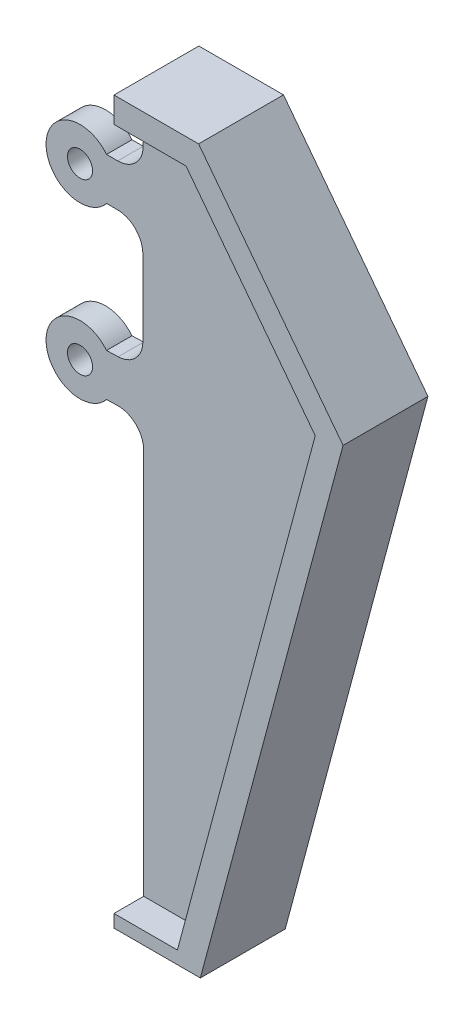
ISO-10303-21;
HEADER;
FILE_DESCRIPTION(('STEP AP214'),'2;1');
FILE_NAME('part.step','',(''),(''),'','','');
FILE_SCHEMA(('AUTOMOTIVE_DESIGN { 1 0 10303 214 1 1 1 1 }'));
ENDSEC;
DATA;
#1=APPLICATION_CONTEXT('core data for automotive mechanical design processes');
#2=APPLICATION_PROTOCOL_DEFINITION('international standard','automotive_design',2000,#1);
#3=PRODUCT_CONTEXT('',#1,'mechanical');
#4=PRODUCT('Part','Part','',(#3));
#5=PRODUCT_RELATED_PRODUCT_CATEGORY('part','',(#4));
#6=PRODUCT_DEFINITION_FORMATION('','',#4);
#7=PRODUCT_DEFINITION_CONTEXT('part definition',#1,'design');
#8=PRODUCT_DEFINITION('design','',#6,#7);
#9=PRODUCT_DEFINITION_SHAPE('','',#8);
#10=(LENGTH_UNIT() NAMED_UNIT(*) SI_UNIT(.MILLI.,.METRE.));
#11=(NAMED_UNIT(*) PLANE_ANGLE_UNIT() SI_UNIT($,.RADIAN.));
#12=(NAMED_UNIT(*) SI_UNIT($,.STERADIAN.) SOLID_ANGLE_UNIT());
#13=UNCERTAINTY_MEASURE_WITH_UNIT(LENGTH_MEASURE(1.E-05),#10,'distance_accuracy_value','');
#14=(GEOMETRIC_REPRESENTATION_CONTEXT(3) GLOBAL_UNCERTAINTY_ASSIGNED_CONTEXT((#13)) GLOBAL_UNIT_ASSIGNED_CONTEXT((#10,
#11,#12)) REPRESENTATION_CONTEXT('',''));
#15=CARTESIAN_POINT('',(0.,0.,0.));
#16=DIRECTION('',(0.,0.,1.));
#17=DIRECTION('',(1.,0.,0.));
#18=AXIS2_PLACEMENT_3D('',#15,#16,#17);
#19=CARTESIAN_POINT('',(81.5633631748623,1.61587612148802,-5.));
#20=DIRECTION('',(-0.965925822985211,0.258819057432683,0.));
#21=DIRECTION('',(-0.258819057432683,-0.965925822985211,0.));
#22=AXIS2_PLACEMENT_3D('',#19,#20,#21);
#23=PLANE('',#22);
#24=DIRECTION('',(0.,0.,1.));
#25=VECTOR('',#24,1.);
#26=CARTESIAN_POINT('',(65.326310514337,-58.9816262786255,-5.));
#27=LINE('',#26,#25);
#28=CARTESIAN_POINT('',(65.326310514337,-58.9816262786255,-5.));
#29=VERTEX_POINT('',#28);
#30=CARTESIAN_POINT('',(65.326310514337,-58.9816262786255,-1.5));
#31=VERTEX_POINT('',#30);
#32=EDGE_CURVE('E429',#29,#31,#27,.T.);
#33=ORIENTED_EDGE('',*,*,#32,.T.);
#34=DIRECTION('',(0.258819057432683,0.965925822985211,0.));
#35=VECTOR('',#34,1.);
#36=CARTESIAN_POINT('',(81.5633631748623,1.61587612148802,-1.5));
#37=LINE('',#36,#35);
#38=CARTESIAN_POINT('',(81.562929535086,1.6142577558935,-1.5));
#39=VERTEX_POINT('',#38);
#40=EDGE_CURVE('E396',#31,#39,#37,.T.);
#41=ORIENTED_EDGE('',*,*,#40,.T.);
#42=DIRECTION('',(0.,0.,-1.));
#43=VECTOR('',#42,1.);
#44=CARTESIAN_POINT('',(81.562929535086,1.61425775589349,-5.));
#45=LINE('',#44,#43);
#46=CARTESIAN_POINT('',(81.562929535086,1.6142577558935,1.5));
#47=VERTEX_POINT('',#46);
#48=EDGE_CURVE('E11',#47,#39,#45,.T.);
#49=ORIENTED_EDGE('',*,*,#48,.F.);
#50=DIRECTION('',(0.258819057432683,0.965925822985211,0.));
#51=VECTOR('',#50,1.);
#52=CARTESIAN_POINT('',(81.5633631748623,1.61587612148802,1.5));
#53=LINE('',#52,#51);
#54=CARTESIAN_POINT('',(65.326310514337,-58.9816262786255,1.5));
#55=VERTEX_POINT('',#54);
#56=EDGE_CURVE('E389',#55,#47,#53,.T.);
#57=ORIENTED_EDGE('',*,*,#56,.F.);
#58=CARTESIAN_POINT('',(65.326310514337,-58.9816262786255,5.));
#59=VERTEX_POINT('',#58);
#60=EDGE_CURVE('E428',#55,#59,#27,.T.);
#61=ORIENTED_EDGE('',*,*,#60,.T.);
#62=DIRECTION('',(-0.258819057432683,-0.965925822985211,0.));
#63=VECTOR('',#62,1.);
#64=CARTESIAN_POINT('',(81.5633631748623,1.61587612148802,5.));
#65=LINE('',#64,#63);
#66=CARTESIAN_POINT('',(81.5633631748623,1.61587612148802,5.));
#67=VERTEX_POINT('',#66);
#68=EDGE_CURVE('E441',#67,#59,#65,.T.);
#69=ORIENTED_EDGE('',*,*,#68,.F.);
#70=DIRECTION('',(0.,0.,1.));
#71=VECTOR('',#70,1.);
#72=CARTESIAN_POINT('',(81.5633631748623,1.61587612148802,-5.));
#73=LINE('',#72,#71);
#74=CARTESIAN_POINT('',(81.5633631748623,1.61587612148802,-5.));
#75=VERTEX_POINT('',#74);
#76=EDGE_CURVE('E492',#75,#67,#73,.T.);
#77=ORIENTED_EDGE('',*,*,#76,.F.);
#78=DIRECTION('',(-0.258819057432683,-0.965925822985211,0.));
#79=VECTOR('',#78,1.);
#80=CARTESIAN_POINT('',(81.5633631748623,1.61587612148802,-5.));
#81=LINE('',#80,#79);
#82=EDGE_CURVE('E465',#75,#29,#81,.T.);
#83=ORIENTED_EDGE('',*,*,#82,.T.);
#84=EDGE_LOOP('',(#33,#41,#49,#57,#61,#69,#77,#83));
#85=FACE_BOUND('',#84,.T.);
#86=ADVANCED_FACE('F33',(#85),#23,.T.);
#87=CARTESIAN_POINT('',(64.9249193695849,-60.4796383480592,-5.));
#88=DIRECTION('',(0.,-1.,0.));
#89=DIRECTION('',(1.,0.,0.));
#90=AXIS2_PLACEMENT_3D('',#87,#88,#89);
#91=PLANE('',#90);
#92=DIRECTION('',(0.,0.,1.));
#93=VECTOR('',#92,1.);
#94=CARTESIAN_POINT('',(64.9253009944768,-60.4796383480592,-5.));
#95=LINE('',#94,#93);
#96=CARTESIAN_POINT('',(64.9253009944768,-60.4796383480592,-1.5));
#97=VERTEX_POINT('',#96);
#98=CARTESIAN_POINT('',(64.9253009944768,-60.4796383480592,1.5));
#99=VERTEX_POINT('',#98);
#100=EDGE_CURVE('E41',#97,#99,#95,.T.);
#101=ORIENTED_EDGE('',*,*,#100,.F.);
#102=DIRECTION('',(-1.,0.,0.));
#103=VECTOR('',#102,1.);
#104=CARTESIAN_POINT('',(64.9249193695849,-60.4796383480592,-1.5));
#105=LINE('',#104,#103);
#106=CARTESIAN_POINT('',(64.9249193695849,-60.4796383480592,-1.5));
#107=VERTEX_POINT('',#106);
#108=EDGE_CURVE('E402',#97,#107,#105,.T.);
#109=ORIENTED_EDGE('',*,*,#108,.T.);
#110=DIRECTION('',(0.,0.,1.));
#111=VECTOR('',#110,1.);
#112=CARTESIAN_POINT('',(64.9249193695849,-60.4796383480592,-5.));
#113=LINE('',#112,#111);
#114=CARTESIAN_POINT('',(64.9249193695849,-60.4796383480592,-5.));
#115=VERTEX_POINT('',#114);
#116=EDGE_CURVE('E488',#115,#107,#113,.T.);
#117=ORIENTED_EDGE('',*,*,#116,.F.);
#118=DIRECTION('',(1.,0.,0.));
#119=VECTOR('',#118,1.);
#120=CARTESIAN_POINT('',(64.9249193695849,-60.4796383480592,-5.));
#121=LINE('',#120,#119);
#122=CARTESIAN_POINT('',(68.0307479214384,-60.4796383480592,-5.));
#123=VERTEX_POINT('',#122);
#124=EDGE_CURVE('E467',#115,#123,#121,.T.);
#125=ORIENTED_EDGE('',*,*,#124,.T.);
#126=DIRECTION('',(0.,0.,1.));
#127=VECTOR('',#126,1.);
#128=CARTESIAN_POINT('',(68.0307479214384,-60.4796383480592,-5.));
#129=LINE('',#128,#127);
#130=CARTESIAN_POINT('',(68.0307479214384,-60.4796383480592,5.));
#131=VERTEX_POINT('',#130);
#132=EDGE_CURVE('E486',#123,#131,#129,.T.);
#133=ORIENTED_EDGE('',*,*,#132,.T.);
#134=DIRECTION('',(1.,0.,0.));
#135=VECTOR('',#134,1.);
#136=CARTESIAN_POINT('',(64.9249193695849,-60.4796383480592,5.));
#137=LINE('',#136,#135);
#138=CARTESIAN_POINT('',(64.9249193695849,-60.4796383480592,5.));
#139=VERTEX_POINT('',#138);
#140=EDGE_CURVE('E444',#139,#131,#137,.T.);
#141=ORIENTED_EDGE('',*,*,#140,.F.);
#142=CARTESIAN_POINT('',(64.9249193695849,-60.4796383480592,1.5));
#143=VERTEX_POINT('',#142);
#144=EDGE_CURVE('E491',#143,#139,#113,.T.);
#145=ORIENTED_EDGE('',*,*,#144,.F.);
#146=DIRECTION('',(-1.,0.,0.));
#147=VECTOR('',#146,1.);
#148=CARTESIAN_POINT('',(64.9249193695849,-60.4796383480592,1.5));
#149=LINE('',#148,#147);
#150=EDGE_CURVE('E52',#99,#143,#149,.T.);
#151=ORIENTED_EDGE('',*,*,#150,.F.);
#152=EDGE_LOOP('',(#101,#109,#117,#125,#133,#141,#145,#151));
#153=FACE_BOUND('',#152,.T.);
#154=ADVANCED_FACE('F512',(#153),#91,.T.);
#155=CARTESIAN_POINT('',(64.9249193695849,-60.4796383480592,5.));
#156=DIRECTION('',(-0.000281150325614666,0.999999960477246,0.));
#157=DIRECTION('',(-0.999999960477247,-0.000281150325614666,0.));
#158=AXIS2_PLACEMENT_3D('',#155,#156,#157);
#159=PLANE('',#158);
#160=DIRECTION('',(0.999999960477247,0.000281150325614666,0.));
#161=VECTOR('',#160,1.);
#162=CARTESIAN_POINT('',(64.9249193695849,-60.4796383480592,-1.5));
#163=LINE('',#162,#161);
#164=CARTESIAN_POINT('',(57.8542162380142,-60.4816262786255,-1.5));
#165=VERTEX_POINT('',#164);
#166=EDGE_CURVE('E399',#165,#107,#163,.T.);
#167=ORIENTED_EDGE('',*,*,#166,.F.);
#168=DIRECTION('',(0.,0.,-1.));
#169=VECTOR('',#168,1.);
#170=CARTESIAN_POINT('',(57.8542162380142,-60.4816262786255,5.));
#171=LINE('',#170,#169);
#172=CARTESIAN_POINT('',(57.8542162380142,-60.4816262786255,-5.));
#173=VERTEX_POINT('',#172);
#174=EDGE_CURVE('E420',#165,#173,#171,.T.);
#175=ORIENTED_EDGE('',*,*,#174,.T.);
#176=DIRECTION('',(0.999999960477246,0.000281150325614666,0.));
#177=VECTOR('',#176,1.);
#178=CARTESIAN_POINT('',(64.9249193695849,-60.4796383480592,-5.));
#179=LINE('',#178,#177);
#180=EDGE_CURVE('E404',#173,#115,#179,.T.);
#181=ORIENTED_EDGE('',*,*,#180,.T.);
#182=ORIENTED_EDGE('',*,*,#116,.T.);
#183=EDGE_LOOP('',(#167,#175,#181,#182));
#184=FACE_BOUND('',#183,.T.);
#185=ADVANCED_FACE('F514',(#184),#159,.F.);
#186=CARTESIAN_POINT('',(57.8542162380142,-58.9816262786255,5.));
#187=DIRECTION('',(0.,-1.,0.));
#188=DIRECTION('',(0.,0.,-1.));
#189=AXIS2_PLACEMENT_3D('',#186,#187,#188);
#190=PLANE('',#189);
#191=DIRECTION('',(-1.,0.,0.));
#192=VECTOR('',#191,1.);
#193=CARTESIAN_POINT('',(57.8542162380142,-58.9816262786255,-1.5));
#194=LINE('',#193,#192);
#195=CARTESIAN_POINT('',(57.8542162380142,-58.9816262786255,-1.5));
#196=VERTEX_POINT('',#195);
#197=EDGE_CURVE('E394',#31,#196,#194,.T.);
#198=ORIENTED_EDGE('',*,*,#197,.F.);
#199=ORIENTED_EDGE('',*,*,#32,.F.);
#200=DIRECTION('',(-1.,0.,0.));
#201=VECTOR('',#200,1.);
#202=CARTESIAN_POINT('',(57.8542162380142,-58.9816262786255,-5.));
#203=LINE('',#202,#201);
#204=CARTESIAN_POINT('',(57.8542162380142,-58.9816262786255,-5.));
#205=VERTEX_POINT('',#204);
#206=EDGE_CURVE('E407',#29,#205,#203,.T.);
#207=ORIENTED_EDGE('',*,*,#206,.T.);
#208=DIRECTION('',(0.,0.,-1.));
#209=VECTOR('',#208,1.);
#210=CARTESIAN_POINT('',(57.8542162380142,-58.9816262786255,5.));
#211=LINE('',#210,#209);
#212=EDGE_CURVE('E424',#196,#205,#211,.T.);
#213=ORIENTED_EDGE('',*,*,#212,.F.);
#214=EDGE_LOOP('',(#198,#199,#207,#213));
#215=FACE_BOUND('',#214,.T.);
#216=ADVANCED_FACE('F528',(#215),#190,.F.);
#217=CARTESIAN_POINT('',(57.8543672775394,21.5203620542722,-5.));
#218=DIRECTION('',(-1.,0.,0.));
#219=DIRECTION('',(0.,0.,1.));
#220=AXIS2_PLACEMENT_3D('',#217,#218,#219);
#221=PLANE('',#220);
#222=DIRECTION('',(0.,0.,1.));
#223=VECTOR('',#222,1.);
#224=CARTESIAN_POINT('',(57.8543672775394,21.5203620542722,-5.));
#225=LINE('',#224,#223);
#226=CARTESIAN_POINT('',(57.8543672775394,21.5203620542722,-5.));
#227=VERTEX_POINT('',#226);
#228=CARTESIAN_POINT('',(57.8543672775394,21.5203620542722,5.));
#229=VERTEX_POINT('',#228);
#230=EDGE_CURVE('E479',#227,#229,#225,.T.);
#231=ORIENTED_EDGE('',*,*,#230,.T.);
#232=DIRECTION('',(0.,-1.,0.));
#233=VECTOR('',#232,1.);
#234=CARTESIAN_POINT('',(57.8543672775394,21.5203620542722,5.));
#235=LINE('',#234,#233);
#236=CARTESIAN_POINT('',(57.8543672775394,24.5203620542722,5.));
#237=VERTEX_POINT('',#236);
#238=EDGE_CURVE('E432',#237,#229,#235,.T.);
#239=ORIENTED_EDGE('',*,*,#238,.F.);
#240=DIRECTION('',(0.,0.,1.));
#241=VECTOR('',#240,1.);
#242=CARTESIAN_POINT('',(57.8543672775394,24.5203620542722,-5.));
#243=LINE('',#242,#241);
#244=CARTESIAN_POINT('',(57.8543672775394,24.5203620542722,-5.));
#245=VERTEX_POINT('',#244);
#246=EDGE_CURVE('E480',#245,#237,#243,.T.);
#247=ORIENTED_EDGE('',*,*,#246,.F.);
#248=DIRECTION('',(0.,-1.,0.));
#249=VECTOR('',#248,1.);
#250=CARTESIAN_POINT('',(57.8543672775394,21.5203620542722,-5.));
#251=LINE('',#250,#249);
#252=EDGE_CURVE('E456',#245,#227,#251,.T.);
#253=ORIENTED_EDGE('',*,*,#252,.T.);
#254=EDGE_LOOP('',(#231,#239,#247,#253));
#255=FACE_BOUND('',#254,.T.);
#256=ADVANCED_FACE('F35',(#255),#221,.T.);
#257=CARTESIAN_POINT('',(57.8543672775394,24.5203620542722,-5.));
#258=DIRECTION('',(0.,1.,0.));
#259=DIRECTION('',(0.,0.,1.));
#260=AXIS2_PLACEMENT_3D('',#257,#258,#259);
#261=PLANE('',#260);
#262=ORIENTED_EDGE('',*,*,#246,.T.);
#263=DIRECTION('',(-1.,0.,0.));
#264=VECTOR('',#263,1.);
#265=CARTESIAN_POINT('',(57.8543672775394,24.5203620542722,5.));
#266=LINE('',#265,#264);
#267=CARTESIAN_POINT('',(67.8252745727534,24.5203620542722,5.));
#268=VERTEX_POINT('',#267);
#269=EDGE_CURVE('E453',#268,#237,#266,.T.);
#270=ORIENTED_EDGE('',*,*,#269,.F.);
#271=DIRECTION('',(0.,0.,1.));
#272=VECTOR('',#271,1.);
#273=CARTESIAN_POINT('',(67.8252745727534,24.5203620542722,-5.));
#274=LINE('',#273,#272);
#275=CARTESIAN_POINT('',(67.8252745727534,24.5203620542722,-5.));
#276=VERTEX_POINT('',#275);
#277=EDGE_CURVE('E482',#276,#268,#274,.T.);
#278=ORIENTED_EDGE('',*,*,#277,.F.);
#279=DIRECTION('',(-1.,0.,0.));
#280=VECTOR('',#279,1.);
#281=CARTESIAN_POINT('',(57.8543672775394,24.5203620542722,-5.));
#282=LINE('',#281,#280);
#283=EDGE_CURVE('E476',#276,#245,#282,.T.);
#284=ORIENTED_EDGE('',*,*,#283,.T.);
#285=EDGE_LOOP('',(#262,#270,#278,#284));
#286=FACE_BOUND('',#285,.T.);
#287=ADVANCED_FACE('F549',(#286),#261,.T.);
#288=CARTESIAN_POINT('',(67.8252745727534,24.5203620542722,-5.));
#289=DIRECTION('',(0.794366396671999,0.607438908729383,0.));
#290=DIRECTION('',(-0.607438908729383,0.794366396671999,0.));
#291=AXIS2_PLACEMENT_3D('',#288,#289,#290);
#292=PLANE('',#291);
#293=ORIENTED_EDGE('',*,*,#277,.T.);
#294=DIRECTION('',(-0.607438908729383,0.794366396671999,0.));
#295=VECTOR('',#294,1.);
#296=CARTESIAN_POINT('',(67.8252745727534,24.5203620542722,5.));
#297=LINE('',#296,#295);
#298=CARTESIAN_POINT('',(84.8432432307497,2.26544514450918,5.));
#299=VERTEX_POINT('',#298);
#300=EDGE_CURVE('E450',#299,#268,#297,.T.);
#301=ORIENTED_EDGE('',*,*,#300,.F.);
#302=DIRECTION('',(0.,0.,1.));
#303=VECTOR('',#302,1.);
#304=CARTESIAN_POINT('',(84.8432432307497,2.26544514450918,-5.));
#305=LINE('',#304,#303);
#306=CARTESIAN_POINT('',(84.8432432307497,2.26544514450918,-5.));
#307=VERTEX_POINT('',#306);
#308=EDGE_CURVE('E484',#307,#299,#305,.T.);
#309=ORIENTED_EDGE('',*,*,#308,.F.);
#310=DIRECTION('',(-0.607438908729383,0.794366396671999,0.));
#311=VECTOR('',#310,1.);
#312=CARTESIAN_POINT('',(67.8252745727534,24.5203620542722,-5.));
#313=LINE('',#312,#311);
#314=EDGE_CURVE('E473',#307,#276,#313,.T.);
#315=ORIENTED_EDGE('',*,*,#314,.T.);
#316=EDGE_LOOP('',(#293,#301,#309,#315));
#317=FACE_BOUND('',#316,.T.);
#318=ADVANCED_FACE('F552',(#317),#292,.T.);
#319=CARTESIAN_POINT('',(84.8432432307497,2.26544514450918,-5.));
#320=DIRECTION('',(0.965925822985211,-0.258819057432683,0.));
#321=DIRECTION('',(0.258819057432683,0.965925822985211,0.));
#322=AXIS2_PLACEMENT_3D('',#319,#320,#321);
#323=PLANE('',#322);
#324=ORIENTED_EDGE('',*,*,#308,.T.);
#325=DIRECTION('',(0.258819057432683,0.965925822985211,0.));
#326=VECTOR('',#325,1.);
#327=CARTESIAN_POINT('',(84.8432432307497,2.26544514450918,5.));
#328=LINE('',#327,#326);
#329=EDGE_CURVE('E447',#131,#299,#328,.T.);
#330=ORIENTED_EDGE('',*,*,#329,.F.);
#331=ORIENTED_EDGE('',*,*,#132,.F.);
#332=DIRECTION('',(0.258819057432683,0.965925822985211,0.));
#333=VECTOR('',#332,1.);
#334=CARTESIAN_POINT('',(84.8432432307497,2.26544514450918,-5.));
#335=LINE('',#334,#333);
#336=EDGE_CURVE('E470',#123,#307,#335,.T.);
#337=ORIENTED_EDGE('',*,*,#336,.T.);
#338=EDGE_LOOP('',(#324,#330,#331,#337));
#339=FACE_BOUND('',#338,.T.);
#340=ADVANCED_FACE('F554',(#339),#323,.T.);
#341=CARTESIAN_POINT('',(66.3427303982443,21.5203620542722,-5.));
#342=DIRECTION('',(-0.794366396671999,-0.607438908729383,0.));
#343=DIRECTION('',(0.607438908729383,-0.794366396671999,0.));
#344=AXIS2_PLACEMENT_3D('',#341,#342,#343);
#345=PLANE('',#344);
#346=ORIENTED_EDGE('',*,*,#76,.T.);
#347=DIRECTION('',(0.607438908729383,-0.794366396671999,0.));
#348=VECTOR('',#347,1.);
#349=CARTESIAN_POINT('',(66.3427303982443,21.5203620542722,5.));
#350=LINE('',#349,#348);
#351=CARTESIAN_POINT('',(66.3427303982443,21.5203620542722,5.));
#352=VERTEX_POINT('',#351);
#353=EDGE_CURVE('E438',#352,#67,#350,.T.);
#354=ORIENTED_EDGE('',*,*,#353,.F.);
#355=DIRECTION('',(0.,0.,1.));
#356=VECTOR('',#355,1.);
#357=CARTESIAN_POINT('',(66.3427303982443,21.5203620542722,-5.));
#358=LINE('',#357,#356);
#359=CARTESIAN_POINT('',(66.3427303982443,21.5203620542722,-5.));
#360=VERTEX_POINT('',#359);
#361=EDGE_CURVE('E494',#360,#352,#358,.T.);
#362=ORIENTED_EDGE('',*,*,#361,.F.);
#363=DIRECTION('',(0.607438908729383,-0.794366396671999,0.));
#364=VECTOR('',#363,1.);
#365=CARTESIAN_POINT('',(66.3427303982443,21.5203620542722,-5.));
#366=LINE('',#365,#364);
#367=EDGE_CURVE('E462',#360,#75,#366,.T.);
#368=ORIENTED_EDGE('',*,*,#367,.T.);
#369=EDGE_LOOP('',(#346,#354,#362,#368));
#370=FACE_BOUND('',#369,.T.);
#371=ADVANCED_FACE('F534',(#370),#345,.T.);
#372=CARTESIAN_POINT('',(57.8543672775394,21.5203620542722,-5.));
#373=DIRECTION('',(0.,-1.,0.));
#374=DIRECTION('',(0.,0.,-1.));
#375=AXIS2_PLACEMENT_3D('',#372,#373,#374);
#376=PLANE('',#375);
#377=ORIENTED_EDGE('',*,*,#361,.T.);
#378=DIRECTION('',(1.,0.,0.));
#379=VECTOR('',#378,1.);
#380=CARTESIAN_POINT('',(57.8543672775394,21.5203620542722,5.));
#381=LINE('',#380,#379);
#382=EDGE_CURVE('E435',#229,#352,#381,.T.);
#383=ORIENTED_EDGE('',*,*,#382,.F.);
#384=ORIENTED_EDGE('',*,*,#230,.F.);
#385=DIRECTION('',(1.,0.,0.));
#386=VECTOR('',#385,1.);
#387=CARTESIAN_POINT('',(57.8543672775394,21.5203620542722,-5.));
#388=LINE('',#387,#386);
#389=EDGE_CURVE('E459',#227,#360,#388,.T.);
#390=ORIENTED_EDGE('',*,*,#389,.T.);
#391=EDGE_LOOP('',(#377,#383,#384,#390));
#392=FACE_BOUND('',#391,.T.);
#393=ADVANCED_FACE('F538',(#392),#376,.T.);
#394=CARTESIAN_POINT('',(0.,0.,-5.));
#395=DIRECTION('',(0.,0.,-1.));
#396=DIRECTION('',(-1.,0.,0.));
#397=AXIS2_PLACEMENT_3D('',#394,#395,#396);
#398=PLANE('',#397);
#399=ORIENTED_EDGE('',*,*,#124,.F.);
#400=ORIENTED_EDGE('',*,*,#180,.F.);
#401=DIRECTION('',(0.,-1.,0.));
#402=VECTOR('',#401,1.);
#403=CARTESIAN_POINT('',(57.8542162380142,-60.4816262786255,-5.));
#404=LINE('',#403,#402);
#405=EDGE_CURVE('E410',#205,#173,#404,.T.);
#406=ORIENTED_EDGE('',*,*,#405,.F.);
#407=ORIENTED_EDGE('',*,*,#206,.F.);
#408=ORIENTED_EDGE('',*,*,#82,.F.);
#409=ORIENTED_EDGE('',*,*,#367,.F.);
#410=ORIENTED_EDGE('',*,*,#389,.F.);
#411=ORIENTED_EDGE('',*,*,#252,.F.);
#412=ORIENTED_EDGE('',*,*,#283,.F.);
#413=ORIENTED_EDGE('',*,*,#314,.F.);
#414=ORIENTED_EDGE('',*,*,#336,.F.);
#415=EDGE_LOOP('',(#399,#400,#406,#407,#408,#409,#410,#411,#412,#413,#414));
#416=FACE_BOUND('',#415,.T.);
#417=ADVANCED_FACE('F518',(#416),#398,.T.);
#418=CARTESIAN_POINT('',(0.,0.,5.));
#419=DIRECTION('',(0.,0.,-1.));
#420=DIRECTION('',(-1.,0.,0.));
#421=AXIS2_PLACEMENT_3D('',#418,#419,#420);
#422=PLANE('',#421);
#423=ORIENTED_EDGE('',*,*,#68,.T.);
#424=DIRECTION('',(-1.,0.,0.));
#425=VECTOR('',#424,1.);
#426=CARTESIAN_POINT('',(57.8542162380142,-58.9816262786255,5.));
#427=LINE('',#426,#425);
#428=CARTESIAN_POINT('',(57.8542162380142,-58.9816262786255,5.));
#429=VERTEX_POINT('',#428);
#430=EDGE_CURVE('E416',#59,#429,#427,.T.);
#431=ORIENTED_EDGE('',*,*,#430,.T.);
#432=DIRECTION('',(0.,-1.,0.));
#433=VECTOR('',#432,1.);
#434=CARTESIAN_POINT('',(57.8542162380142,-60.4816262786255,5.));
#435=LINE('',#434,#433);
#436=CARTESIAN_POINT('',(57.8542162380142,-60.4816262786255,5.));
#437=VERTEX_POINT('',#436);
#438=EDGE_CURVE('E418',#429,#437,#435,.T.);
#439=ORIENTED_EDGE('',*,*,#438,.T.);
#440=DIRECTION('',(0.999999960477246,0.000281150325614666,0.));
#441=VECTOR('',#440,1.);
#442=CARTESIAN_POINT('',(64.9249193695849,-60.4796383480592,5.));
#443=LINE('',#442,#441);
#444=EDGE_CURVE('E413',#437,#139,#443,.T.);
#445=ORIENTED_EDGE('',*,*,#444,.T.);
#446=ORIENTED_EDGE('',*,*,#140,.T.);
#447=ORIENTED_EDGE('',*,*,#329,.T.);
#448=ORIENTED_EDGE('',*,*,#300,.T.);
#449=ORIENTED_EDGE('',*,*,#269,.T.);
#450=ORIENTED_EDGE('',*,*,#238,.T.);
#451=ORIENTED_EDGE('',*,*,#382,.T.);
#452=ORIENTED_EDGE('',*,*,#353,.T.);
#453=EDGE_LOOP('',(#423,#431,#439,#445,#446,#447,#448,#449,#450,#451,#452));
#454=FACE_BOUND('',#453,.T.);
#455=ADVANCED_FACE('F540',(#454),#422,.F.);
#456=CARTESIAN_POINT('',(57.8542162380142,-60.4816262786255,1.5));
#457=VERTEX_POINT('',#456);
#458=EDGE_CURVE('E421',#437,#457,#171,.T.);
#459=ORIENTED_EDGE('',*,*,#458,.T.);
#460=DIRECTION('',(0.999999960477247,0.000281150325614666,0.));
#461=VECTOR('',#460,1.);
#462=CARTESIAN_POINT('',(64.9249193695849,-60.4796383480592,1.5));
#463=LINE('',#462,#461);
#464=EDGE_CURVE('E391',#457,#143,#463,.T.);
#465=ORIENTED_EDGE('',*,*,#464,.T.);
#466=ORIENTED_EDGE('',*,*,#144,.T.);
#467=ORIENTED_EDGE('',*,*,#444,.F.);
#468=EDGE_LOOP('',(#459,#465,#466,#467));
#469=FACE_BOUND('',#468,.T.);
#470=ADVANCED_FACE('F561',(#469),#159,.F.);
#471=ORIENTED_EDGE('',*,*,#60,.F.);
#472=DIRECTION('',(-1.,0.,0.));
#473=VECTOR('',#472,1.);
#474=CARTESIAN_POINT('',(57.8542162380142,-58.9816262786255,1.5));
#475=LINE('',#474,#473);
#476=CARTESIAN_POINT('',(57.8542162380142,-58.9816262786255,1.5));
#477=VERTEX_POINT('',#476);
#478=EDGE_CURVE('E358',#55,#477,#475,.T.);
#479=ORIENTED_EDGE('',*,*,#478,.T.);
#480=EDGE_CURVE('E425',#429,#477,#211,.T.);
#481=ORIENTED_EDGE('',*,*,#480,.F.);
#482=ORIENTED_EDGE('',*,*,#430,.F.);
#483=EDGE_LOOP('',(#471,#479,#481,#482));
#484=FACE_BOUND('',#483,.T.);
#485=ADVANCED_FACE('F567',(#484),#190,.F.);
#486=CARTESIAN_POINT('',(57.8542162380142,-60.4816262786255,5.));
#487=DIRECTION('',(1.,0.,0.));
#488=DIRECTION('',(0.,0.,-1.));
#489=AXIS2_PLACEMENT_3D('',#486,#487,#488);
#490=PLANE('',#489);
#491=ORIENTED_EDGE('',*,*,#480,.T.);
#492=DIRECTION('',(0.,-1.,0.));
#493=VECTOR('',#492,1.);
#494=CARTESIAN_POINT('',(57.8542162380142,-60.4816262786255,1.5));
#495=LINE('',#494,#493);
#496=CARTESIAN_POINT('',(57.8542162380142,-13.4527588718872,1.5));
#497=VERTEX_POINT('',#496);
#498=EDGE_CURVE('E299',#497,#477,#495,.T.);
#499=ORIENTED_EDGE('',*,*,#498,.F.);
#500=DIRECTION('',(0.,0.,1.));
#501=VECTOR('',#500,1.);
#502=CARTESIAN_POINT('',(57.8542162380142,-13.4527588718872,-1.5));
#503=LINE('',#502,#501);
#504=CARTESIAN_POINT('',(57.8542162380142,-13.4527588718872,-1.5));
#505=VERTEX_POINT('',#504);
#506=EDGE_CURVE('E366',#505,#497,#503,.T.);
#507=ORIENTED_EDGE('',*,*,#506,.F.);
#508=DIRECTION('',(0.,-1.,0.));
#509=VECTOR('',#508,1.);
#510=CARTESIAN_POINT('',(57.8542162380142,-60.4816262786255,-1.5));
#511=LINE('',#510,#509);
#512=EDGE_CURVE('E343',#505,#196,#511,.T.);
#513=ORIENTED_EDGE('',*,*,#512,.T.);
#514=ORIENTED_EDGE('',*,*,#212,.T.);
#515=ORIENTED_EDGE('',*,*,#405,.T.);
#516=ORIENTED_EDGE('',*,*,#174,.F.);
#517=DIRECTION('',(0.,0.,1.));
#518=VECTOR('',#517,1.);
#519=CARTESIAN_POINT('',(57.8542162380142,-60.4816262786255,-1.5));
#520=LINE('',#519,#518);
#521=EDGE_CURVE('E364',#165,#457,#520,.T.);
#522=ORIENTED_EDGE('',*,*,#521,.T.);
#523=ORIENTED_EDGE('',*,*,#458,.F.);
#524=ORIENTED_EDGE('',*,*,#438,.F.);
#525=EDGE_LOOP('',(#491,#499,#507,#513,#514,#515,#516,#522,#523,#524));
#526=FACE_BOUND('',#525,.T.);
#527=ADVANCED_FACE('F522',(#526),#490,.F.);
#528=CARTESIAN_POINT('',(64.9247683300598,-60.4816262786255,-1.5));
#529=DIRECTION('',(0.,-1.,0.));
#530=DIRECTION('',(0.,0.,-1.));
#531=AXIS2_PLACEMENT_3D('',#528,#529,#530);
#532=PLANE('',#531);
#533=DIRECTION('',(0.,0.,1.));
#534=VECTOR('',#533,1.);
#535=CARTESIAN_POINT('',(64.9247683300598,-60.4816262786255,-1.5));
#536=LINE('',#535,#534);
#537=CARTESIAN_POINT('',(64.9247683300598,-60.4816262786255,-1.5));
#538=VERTEX_POINT('',#537);
#539=CARTESIAN_POINT('',(64.9247683300598,-60.4816262786255,1.5));
#540=VERTEX_POINT('',#539);
#541=EDGE_CURVE('E362',#538,#540,#536,.T.);
#542=ORIENTED_EDGE('',*,*,#541,.T.);
#543=DIRECTION('',(1.,0.,0.));
#544=VECTOR('',#543,1.);
#545=CARTESIAN_POINT('',(64.9247683300598,-60.4816262786255,1.5));
#546=LINE('',#545,#544);
#547=EDGE_CURVE('E301',#457,#540,#546,.T.);
#548=ORIENTED_EDGE('',*,*,#547,.F.);
#549=ORIENTED_EDGE('',*,*,#521,.F.);
#550=DIRECTION('',(1.,0.,0.));
#551=VECTOR('',#550,1.);
#552=CARTESIAN_POINT('',(64.9247683300598,-60.4816262786255,-1.5));
#553=LINE('',#552,#551);
#554=EDGE_CURVE('E346',#165,#538,#553,.T.);
#555=ORIENTED_EDGE('',*,*,#554,.T.);
#556=EDGE_LOOP('',(#542,#548,#549,#555));
#557=FACE_BOUND('',#556,.T.);
#558=ADVANCED_FACE('F506',(#557),#532,.T.);
#559=CARTESIAN_POINT('',(54.8542162380142,-13.4527588718872,1.5));
#560=DIRECTION('',(0.,0.,1.));
#561=DIRECTION('',(1.,0.,0.));
#562=AXIS2_PLACEMENT_3D('',#559,#560,#561);
#563=PLANE('',#562);
#564=DIRECTION('',(0.258819057432683,0.965925822985211,0.));
#565=VECTOR('',#564,1.);
#566=CARTESIAN_POINT('',(81.5632121353371,1.6138881909217,1.5));
#567=LINE('',#566,#565);
#568=EDGE_CURVE('E304',#540,#99,#567,.T.);
#569=ORIENTED_EDGE('',*,*,#568,.T.);
#570=ORIENTED_EDGE('',*,*,#150,.T.);
#571=ORIENTED_EDGE('',*,*,#464,.F.);
#572=ORIENTED_EDGE('',*,*,#547,.T.);
#573=EDGE_LOOP('',(#569,#570,#571,#572));
#574=FACE_BOUND('',#573,.T.);
#575=ADVANCED_FACE('F501',(#574),#563,.T.);
#576=CARTESIAN_POINT('',(54.8542162380142,-13.4527588718872,-1.5));
#577=DIRECTION('',(0.,0.,1.));
#578=DIRECTION('',(1.,0.,0.));
#579=AXIS2_PLACEMENT_3D('',#576,#577,#578);
#580=PLANE('',#579);
#581=ORIENTED_EDGE('',*,*,#108,.F.);
#582=DIRECTION('',(0.258819057432683,0.965925822985211,0.));
#583=VECTOR('',#582,1.);
#584=CARTESIAN_POINT('',(81.5632121353371,1.6138881909217,-1.5));
#585=LINE('',#584,#583);
#586=EDGE_CURVE('E349',#538,#97,#585,.T.);
#587=ORIENTED_EDGE('',*,*,#586,.F.);
#588=ORIENTED_EDGE('',*,*,#554,.F.);
#589=ORIENTED_EDGE('',*,*,#166,.T.);
#590=EDGE_LOOP('',(#581,#587,#588,#589));
#591=FACE_BOUND('',#590,.T.);
#592=ADVANCED_FACE('F509',(#591),#580,.F.);
#593=CARTESIAN_POINT('',(81.5632121353371,1.6138881909217,-1.5));
#594=DIRECTION('',(0.965925822985211,-0.258819057432683,0.));
#595=DIRECTION('',(0.258819057432683,0.965925822985211,0.));
#596=AXIS2_PLACEMENT_3D('',#593,#594,#595);
#597=PLANE('',#596);
#598=ORIENTED_EDGE('',*,*,#586,.T.);
#599=ORIENTED_EDGE('',*,*,#100,.T.);
#600=ORIENTED_EDGE('',*,*,#568,.F.);
#601=ORIENTED_EDGE('',*,*,#541,.F.);
#602=EDGE_LOOP('',(#598,#599,#600,#601));
#603=FACE_BOUND('',#602,.T.);
#604=ADVANCED_FACE('F498',(#603),#597,.T.);
#605=CARTESIAN_POINT('',(57.7976826953534,17.4764179746904,-1.5));
#606=DIRECTION('',(-0.99990220075601,0.0139853109828804,0.));
#607=DIRECTION('',(-0.0139853109828804,-0.99990220075601,0.));
#608=AXIS2_PLACEMENT_3D('',#605,#606,#607);
#609=PLANE('',#608);
#610=DIRECTION('',(0.,0.,1.));
#611=VECTOR('',#610,1.);
#612=CARTESIAN_POINT('',(57.7976826953534,17.4764179746904,-1.5));
#613=LINE('',#612,#611);
#614=CARTESIAN_POINT('',(57.7976826953534,17.4764179746904,-1.5));
#615=VERTEX_POINT('',#614);
#616=CARTESIAN_POINT('',(57.7976826953534,17.4764179746904,1.5));
#617=VERTEX_POINT('',#616);
#618=EDGE_CURVE('E239',#615,#617,#613,.T.);
#619=ORIENTED_EDGE('',*,*,#618,.T.);
#620=DIRECTION('',(-0.0139853109828804,-0.99990220075601,0.));
#621=VECTOR('',#620,1.);
#622=CARTESIAN_POINT('',(57.7976826953534,17.4764179746904,1.5));
#623=LINE('',#622,#621);
#624=CARTESIAN_POINT('',(57.8542162380142,21.5183741237059,1.5));
#625=VERTEX_POINT('',#624);
#626=EDGE_CURVE('E243',#625,#617,#623,.T.);
#627=ORIENTED_EDGE('',*,*,#626,.F.);
#628=DIRECTION('',(0.,0.,1.));
#629=VECTOR('',#628,1.);
#630=CARTESIAN_POINT('',(57.8542162380142,21.5183741237059,-1.5));
#631=LINE('',#630,#629);
#632=CARTESIAN_POINT('',(57.8542162380142,21.5183741237059,-1.5));
#633=VERTEX_POINT('',#632);
#634=EDGE_CURVE('E356',#633,#625,#631,.T.);
#635=ORIENTED_EDGE('',*,*,#634,.F.);
#636=DIRECTION('',(-0.0139853109828804,-0.99990220075601,0.));
#637=VECTOR('',#636,1.);
#638=CARTESIAN_POINT('',(57.7976826953534,17.4764179746904,-1.5));
#639=LINE('',#638,#637);
#640=EDGE_CURVE('E245',#633,#615,#639,.T.);
#641=ORIENTED_EDGE('',*,*,#640,.T.);
#642=EDGE_LOOP('',(#619,#627,#635,#641));
#643=FACE_BOUND('',#642,.T.);
#644=ADVANCED_FACE('F241',(#643),#609,.T.);
#645=CARTESIAN_POINT('',(57.8542162380142,21.5183741237059,-1.5));
#646=DIRECTION('',(0.,1.,0.));
#647=DIRECTION('',(0.,0.,1.));
#648=AXIS2_PLACEMENT_3D('',#645,#646,#647);
#649=PLANE('',#648);
#650=ORIENTED_EDGE('',*,*,#634,.T.);
#651=DIRECTION('',(-1.,0.,0.));
#652=VECTOR('',#651,1.);
#653=CARTESIAN_POINT('',(57.8542162380142,21.5183741237059,1.5));
#654=LINE('',#653,#652);
#655=CARTESIAN_POINT('',(66.3425793587191,21.5183741237059,1.5));
#656=VERTEX_POINT('',#655);
#657=EDGE_CURVE('E263',#656,#625,#654,.T.);
#658=ORIENTED_EDGE('',*,*,#657,.F.);
#659=DIRECTION('',(0.,0.,1.));
#660=VECTOR('',#659,1.);
#661=CARTESIAN_POINT('',(66.3425793587191,21.5183741237059,-1.5));
#662=LINE('',#661,#660);
#663=CARTESIAN_POINT('',(66.3425793587191,21.5183741237059,-1.5));
#664=VERTEX_POINT('',#663);
#665=EDGE_CURVE('E359',#664,#656,#662,.T.);
#666=ORIENTED_EDGE('',*,*,#665,.F.);
#667=DIRECTION('',(-1.,0.,0.));
#668=VECTOR('',#667,1.);
#669=CARTESIAN_POINT('',(57.8542162380142,21.5183741237059,-1.5));
#670=LINE('',#669,#668);
#671=EDGE_CURVE('E250',#664,#633,#670,.T.);
#672=ORIENTED_EDGE('',*,*,#671,.T.);
#673=EDGE_LOOP('',(#650,#658,#666,#672));
#674=FACE_BOUND('',#673,.T.);
#675=ADVANCED_FACE('F579',(#674),#649,.T.);
#676=CARTESIAN_POINT('',(66.3425793587191,21.5183741237059,-1.5));
#677=DIRECTION('',(0.794366396671999,0.607438908729384,0.));
#678=DIRECTION('',(-0.607438908729384,0.794366396671999,0.));
#679=AXIS2_PLACEMENT_3D('',#676,#677,#678);
#680=PLANE('',#679);
#681=DIRECTION('',(-0.607438908729384,0.794366396671999,0.));
#682=VECTOR('',#681,1.);
#683=CARTESIAN_POINT('',(66.3425793587191,21.5183741237059,1.5));
#684=LINE('',#683,#682);
#685=EDGE_CURVE('E307',#47,#656,#684,.T.);
#686=ORIENTED_EDGE('',*,*,#685,.F.);
#687=ORIENTED_EDGE('',*,*,#48,.T.);
#688=DIRECTION('',(-0.607438908729384,0.794366396671999,0.));
#689=VECTOR('',#688,1.);
#690=CARTESIAN_POINT('',(66.3425793587191,21.5183741237059,-1.5));
#691=LINE('',#690,#689);
#692=EDGE_CURVE('E352',#39,#664,#691,.T.);
#693=ORIENTED_EDGE('',*,*,#692,.T.);
#694=ORIENTED_EDGE('',*,*,#665,.T.);
#695=EDGE_LOOP('',(#686,#687,#693,#694));
#696=FACE_BOUND('',#695,.T.);
#697=ADVANCED_FACE('F573',(#696),#680,.T.);
#698=CARTESIAN_POINT('',(54.8542162380142,-13.4527588718872,-1.5));
#699=DIRECTION('',(0.,0.,1.));
#700=DIRECTION('',(1.,0.,0.));
#701=AXIS2_PLACEMENT_3D('',#698,#699,#700);
#702=CYLINDRICAL_SURFACE('',#701,3.);
#703=ORIENTED_EDGE('',*,*,#506,.T.);
#704=CARTESIAN_POINT('',(54.8542162380142,-13.4527588718872,1.5));
#705=DIRECTION('',(0.,0.,-1.));
#706=DIRECTION('',(1.,0.,0.));
#707=AXIS2_PLACEMENT_3D('',#704,#705,#706);
#708=CIRCLE('',#707,3.);
#709=CARTESIAN_POINT('',(54.7898575809431,-10.4534492907902,1.5));
#710=VERTEX_POINT('',#709);
#711=EDGE_CURVE('E296',#710,#497,#708,.T.);
#712=ORIENTED_EDGE('',*,*,#711,.F.);
#713=DIRECTION('',(0.,0.,1.));
#714=VECTOR('',#713,1.);
#715=CARTESIAN_POINT('',(54.7898575809431,-10.4534492907902,-1.5));
#716=LINE('',#715,#714);
#717=CARTESIAN_POINT('',(54.7898575809431,-10.4534492907902,-1.5));
#718=VERTEX_POINT('',#717);
#719=EDGE_CURVE('E368',#718,#710,#716,.T.);
#720=ORIENTED_EDGE('',*,*,#719,.F.);
#721=CARTESIAN_POINT('',(54.8542162380142,-13.4527588718872,-1.5));
#722=DIRECTION('',(0.,0.,-1.));
#723=DIRECTION('',(1.,0.,0.));
#724=AXIS2_PLACEMENT_3D('',#721,#722,#723);
#725=CIRCLE('',#724,3.);
#726=EDGE_CURVE('E340',#718,#505,#725,.T.);
#727=ORIENTED_EDGE('',*,*,#726,.T.);
#728=EDGE_LOOP('',(#703,#712,#720,#727));
#729=FACE_BOUND('',#728,.T.);
#730=ADVANCED_FACE('F586',(#729),#702,.F.);
#731=CARTESIAN_POINT('',(54.7898575809431,-10.4534492907902,-1.5));
#732=DIRECTION('',(0.0214528856903844,-0.999769860365652,0.));
#733=DIRECTION('',(0.999769860365652,0.0214528856903844,0.));
#734=AXIS2_PLACEMENT_3D('',#731,#732,#733);
#735=PLANE('',#734);
#736=ORIENTED_EDGE('',*,*,#719,.T.);
#737=DIRECTION('',(0.999769860365652,0.0214528856903844,0.));
#738=VECTOR('',#737,1.);
#739=CARTESIAN_POINT('',(54.7898575809431,-10.4534492907902,1.5));
#740=LINE('',#739,#738);
#741=CARTESIAN_POINT('',(53.4767153854443,-10.48162646489,1.5));
#742=VERTEX_POINT('',#741);
#743=EDGE_CURVE('E293',#742,#710,#740,.T.);
#744=ORIENTED_EDGE('',*,*,#743,.F.);
#745=DIRECTION('',(0.,0.,1.));
#746=VECTOR('',#745,1.);
#747=CARTESIAN_POINT('',(53.4767153854443,-10.48162646489,-1.5));
#748=LINE('',#747,#746);
#749=CARTESIAN_POINT('',(53.4767153854443,-10.48162646489,-1.5));
#750=VERTEX_POINT('',#749);
#751=EDGE_CURVE('E370',#750,#742,#748,.T.);
#752=ORIENTED_EDGE('',*,*,#751,.F.);
#753=DIRECTION('',(0.999769860365652,0.0214528856903844,0.));
#754=VECTOR('',#753,1.);
#755=CARTESIAN_POINT('',(54.7898575809431,-10.4534492907902,-1.5));
#756=LINE('',#755,#754);
#757=EDGE_CURVE('E337',#750,#718,#756,.T.);
#758=ORIENTED_EDGE('',*,*,#757,.T.);
#759=EDGE_LOOP('',(#736,#744,#752,#758));
#760=FACE_BOUND('',#759,.T.);
#761=ADVANCED_FACE('F744',(#760),#735,.T.);
#762=CARTESIAN_POINT('',(50.3542165279195,-7.98162628793871,-1.5));
#763=DIRECTION('',(0.,0.,1.));
#764=DIRECTION('',(1.,0.,0.));
#765=AXIS2_PLACEMENT_3D('',#762,#763,#764);
#766=CYLINDRICAL_SURFACE('',#765,4.);
#767=ORIENTED_EDGE('',*,*,#751,.T.);
#768=CARTESIAN_POINT('',(50.3542165279195,-7.98162628793871,1.5));
#769=DIRECTION('',(0.,0.,1.));
#770=DIRECTION('',(1.,0.,0.));
#771=AXIS2_PLACEMENT_3D('',#768,#769,#770);
#772=CIRCLE('',#771,4.);
#773=CARTESIAN_POINT('',(53.4767153854443,-5.48162611098742,1.5));
#774=VERTEX_POINT('',#773);
#775=EDGE_CURVE('E290',#774,#742,#772,.T.);
#776=ORIENTED_EDGE('',*,*,#775,.F.);
#777=DIRECTION('',(0.,0.,1.));
#778=VECTOR('',#777,1.);
#779=CARTESIAN_POINT('',(53.4767153854443,-5.48162611098742,-1.5));
#780=LINE('',#779,#778);
#781=CARTESIAN_POINT('',(53.4767153854443,-5.48162611098742,-1.5));
#782=VERTEX_POINT('',#781);
#783=EDGE_CURVE('E372',#782,#774,#780,.T.);
#784=ORIENTED_EDGE('',*,*,#783,.F.);
#785=CARTESIAN_POINT('',(50.3542165279195,-7.98162628793871,-1.5));
#786=DIRECTION('',(0.,0.,1.));
#787=DIRECTION('',(1.,0.,0.));
#788=AXIS2_PLACEMENT_3D('',#785,#786,#787);
#789=CIRCLE('',#788,4.);
#790=EDGE_CURVE('E334',#782,#750,#789,.T.);
#791=ORIENTED_EDGE('',*,*,#790,.T.);
#792=EDGE_LOOP('',(#767,#776,#784,#791));
#793=FACE_BOUND('',#792,.T.);
#794=ADVANCED_FACE('F754',(#793),#766,.T.);
#795=CARTESIAN_POINT('',(53.4767153854443,-5.48162611098742,-1.5));
#796=DIRECTION('',(-0.0312952109476891,0.999510184926467,0.));
#797=DIRECTION('',(-0.999510184926467,-0.0312952109476892,0.));
#798=AXIS2_PLACEMENT_3D('',#795,#796,#797);
#799=PLANE('',#798);
#800=ORIENTED_EDGE('',*,*,#783,.T.);
#801=DIRECTION('',(-0.999510184926467,-0.0312952109476891,0.));
#802=VECTOR('',#801,1.);
#803=CARTESIAN_POINT('',(53.4767153854443,-5.48162611098742,1.5));
#804=LINE('',#803,#802);
#805=CARTESIAN_POINT('',(54.8501951157487,-5.43862170889079,1.5));
#806=VERTEX_POINT('',#805);
#807=EDGE_CURVE('E287',#806,#774,#804,.T.);
#808=ORIENTED_EDGE('',*,*,#807,.F.);
#809=DIRECTION('',(0.,0.,1.));
#810=VECTOR('',#809,1.);
#811=CARTESIAN_POINT('',(54.8501951157487,-5.43862170889079,-1.5));
#812=LINE('',#811,#810);
#813=CARTESIAN_POINT('',(54.8501951157487,-5.43862170889079,-1.5));
#814=VERTEX_POINT('',#813);
#815=EDGE_CURVE('E374',#814,#806,#812,.T.);
#816=ORIENTED_EDGE('',*,*,#815,.F.);
#817=DIRECTION('',(-0.999510184926467,-0.0312952109476891,0.));
#818=VECTOR('',#817,1.);
#819=CARTESIAN_POINT('',(53.4767153854443,-5.48162611098742,-1.5));
#820=LINE('',#819,#818);
#821=EDGE_CURVE('E331',#814,#782,#820,.T.);
#822=ORIENTED_EDGE('',*,*,#821,.T.);
#823=EDGE_LOOP('',(#800,#808,#816,#822));
#824=FACE_BOUND('',#823,.T.);
#825=ADVANCED_FACE('F764',(#824),#799,.T.);
#826=CARTESIAN_POINT('',(54.7563094829057,-2.44009115411139,-1.5));
#827=DIRECTION('',(0.,0.,1.));
#828=DIRECTION('',(1.,0.,0.));
#829=AXIS2_PLACEMENT_3D('',#826,#827,#828);
#830=CYLINDRICAL_SURFACE('',#829,3.);
#831=ORIENTED_EDGE('',*,*,#815,.T.);
#832=CARTESIAN_POINT('',(54.7563094829057,-2.44009115411139,1.5));
#833=DIRECTION('',(0.,0.,-1.));
#834=DIRECTION('',(-1.,0.,0.));
#835=AXIS2_PLACEMENT_3D('',#832,#833,#834);
#836=CIRCLE('',#835,3.);
#837=CARTESIAN_POINT('',(57.7563094829057,-2.44009115411137,1.5));
#838=VERTEX_POINT('',#837);
#839=EDGE_CURVE('E284',#838,#806,#836,.T.);
#840=ORIENTED_EDGE('',*,*,#839,.F.);
#841=DIRECTION('',(0.,0.,1.));
#842=VECTOR('',#841,1.);
#843=CARTESIAN_POINT('',(57.7563094829057,-2.44009115411137,-1.5));
#844=LINE('',#843,#842);
#845=CARTESIAN_POINT('',(57.7563094829057,-2.44009115411137,-1.5));
#846=VERTEX_POINT('',#845);
#847=EDGE_CURVE('E376',#846,#838,#844,.T.);
#848=ORIENTED_EDGE('',*,*,#847,.F.);
#849=CARTESIAN_POINT('',(54.7563094829057,-2.44009115411139,-1.5));
#850=DIRECTION('',(0.,0.,-1.));
#851=DIRECTION('',(-1.,0.,0.));
#852=AXIS2_PLACEMENT_3D('',#849,#850,#851);
#853=CIRCLE('',#852,3.);
#854=EDGE_CURVE('E328',#846,#814,#853,.T.);
#855=ORIENTED_EDGE('',*,*,#854,.T.);
#856=EDGE_LOOP('',(#831,#840,#848,#855));
#857=FACE_BOUND('',#856,.T.);
#858=ADVANCED_FACE('F774',(#857),#830,.F.);
#859=CARTESIAN_POINT('',(57.7563094829057,-2.44009115411137,-1.5));
#860=DIRECTION('',(-1.,0.,0.));
#861=DIRECTION('',(0.,0.,1.));
#862=AXIS2_PLACEMENT_3D('',#859,#860,#861);
#863=PLANE('',#862);
#864=ORIENTED_EDGE('',*,*,#847,.T.);
#865=DIRECTION('',(0.,-1.,0.));
#866=VECTOR('',#865,1.);
#867=CARTESIAN_POINT('',(57.7563094829057,-2.44009115411137,1.5));
#868=LINE('',#867,#866);
#869=CARTESIAN_POINT('',(57.7563094829057,6.51837355373643,1.5));
#870=VERTEX_POINT('',#869);
#871=EDGE_CURVE('E281',#870,#838,#868,.T.);
#872=ORIENTED_EDGE('',*,*,#871,.F.);
#873=DIRECTION('',(0.,0.,1.));
#874=VECTOR('',#873,1.);
#875=CARTESIAN_POINT('',(57.7563094829057,6.51837355373643,-1.5));
#876=LINE('',#875,#874);
#877=CARTESIAN_POINT('',(57.7563094829057,6.51837355373643,-1.5));
#878=VERTEX_POINT('',#877);
#879=EDGE_CURVE('E378',#878,#870,#876,.T.);
#880=ORIENTED_EDGE('',*,*,#879,.F.);
#881=DIRECTION('',(0.,-1.,0.));
#882=VECTOR('',#881,1.);
#883=CARTESIAN_POINT('',(57.7563094829057,-2.44009115411137,-1.5));
#884=LINE('',#883,#882);
#885=EDGE_CURVE('E325',#878,#846,#884,.T.);
#886=ORIENTED_EDGE('',*,*,#885,.T.);
#887=EDGE_LOOP('',(#864,#872,#880,#886));
#888=FACE_BOUND('',#887,.T.);
#889=ADVANCED_FACE('F784',(#888),#863,.T.);
#890=CARTESIAN_POINT('',(54.7563094829057,6.51837355373645,-1.5));
#891=DIRECTION('',(0.,0.,1.));
#892=DIRECTION('',(1.,0.,0.));
#893=AXIS2_PLACEMENT_3D('',#890,#891,#892);
#894=CYLINDRICAL_SURFACE('',#893,3.);
#895=ORIENTED_EDGE('',*,*,#879,.T.);
#896=CARTESIAN_POINT('',(54.7563094829057,6.51837355373645,1.5));
#897=DIRECTION('',(0.,0.,-1.));
#898=DIRECTION('',(1.,0.,0.));
#899=AXIS2_PLACEMENT_3D('',#896,#897,#898);
#900=CIRCLE('',#899,3.);
#901=CARTESIAN_POINT('',(54.7563094829057,9.51837355373645,1.5));
#902=VERTEX_POINT('',#901);
#903=EDGE_CURVE('E278',#902,#870,#900,.T.);
#904=ORIENTED_EDGE('',*,*,#903,.F.);
#905=DIRECTION('',(0.,0.,1.));
#906=VECTOR('',#905,1.);
#907=CARTESIAN_POINT('',(54.7563094829057,9.51837355373645,-1.5));
#908=LINE('',#907,#906);
#909=CARTESIAN_POINT('',(54.7563094829057,9.51837355373645,-1.5));
#910=VERTEX_POINT('',#909);
#911=EDGE_CURVE('E380',#910,#902,#908,.T.);
#912=ORIENTED_EDGE('',*,*,#911,.F.);
#913=CARTESIAN_POINT('',(54.7563094829057,6.51837355373645,-1.5));
#914=DIRECTION('',(0.,0.,-1.));
#915=DIRECTION('',(1.,0.,0.));
#916=AXIS2_PLACEMENT_3D('',#913,#914,#915);
#917=CIRCLE('',#916,3.);
#918=EDGE_CURVE('E322',#910,#878,#917,.T.);
#919=ORIENTED_EDGE('',*,*,#918,.T.);
#920=EDGE_LOOP('',(#895,#904,#912,#919));
#921=FACE_BOUND('',#920,.T.);
#922=ADVANCED_FACE('F794',(#921),#894,.F.);
#923=CARTESIAN_POINT('',(54.7563094829057,9.51837355373645,-1.5));
#924=DIRECTION('',(0.,-1.,0.));
#925=DIRECTION('',(0.,0.,-1.));
#926=AXIS2_PLACEMENT_3D('',#923,#924,#925);
#927=PLANE('',#926);
#928=ORIENTED_EDGE('',*,*,#911,.T.);
#929=DIRECTION('',(1.,0.,0.));
#930=VECTOR('',#929,1.);
#931=CARTESIAN_POINT('',(54.7563094829057,9.51837355373645,1.5));
#932=LINE('',#931,#930);
#933=CARTESIAN_POINT('',(53.4767153854443,9.51837355373645,1.5));
#934=VERTEX_POINT('',#933);
#935=EDGE_CURVE('E275',#934,#902,#932,.T.);
#936=ORIENTED_EDGE('',*,*,#935,.F.);
#937=DIRECTION('',(0.,0.,1.));
#938=VECTOR('',#937,1.);
#939=CARTESIAN_POINT('',(53.4767153854443,9.51837355373645,-1.5));
#940=LINE('',#939,#938);
#941=CARTESIAN_POINT('',(53.4767153854443,9.51837355373645,-1.5));
#942=VERTEX_POINT('',#941);
#943=EDGE_CURVE('E382',#942,#934,#940,.T.);
#944=ORIENTED_EDGE('',*,*,#943,.F.);
#945=DIRECTION('',(1.,0.,0.));
#946=VECTOR('',#945,1.);
#947=CARTESIAN_POINT('',(54.7563094829057,9.51837355373645,-1.5));
#948=LINE('',#947,#946);
#949=EDGE_CURVE('E319',#942,#910,#948,.T.);
#950=ORIENTED_EDGE('',*,*,#949,.T.);
#951=EDGE_LOOP('',(#928,#936,#944,#950));
#952=FACE_BOUND('',#951,.T.);
#953=ADVANCED_FACE('F804',(#952),#927,.T.);
#954=CARTESIAN_POINT('',(50.3542165279195,12.0183737306877,-1.5));
#955=DIRECTION('',(0.,0.,1.));
#956=DIRECTION('',(1.,0.,0.));
#957=AXIS2_PLACEMENT_3D('',#954,#955,#956);
#958=CYLINDRICAL_SURFACE('',#957,4.);
#959=ORIENTED_EDGE('',*,*,#943,.T.);
#960=CARTESIAN_POINT('',(50.3542165279195,12.0183737306877,1.5));
#961=DIRECTION('',(0.,0.,1.));
#962=DIRECTION('',(1.,0.,0.));
#963=AXIS2_PLACEMENT_3D('',#960,#961,#962);
#964=CIRCLE('',#963,4.);
#965=CARTESIAN_POINT('',(53.4767153854443,14.518373907639,1.5));
#966=VERTEX_POINT('',#965);
#967=EDGE_CURVE('E272',#966,#934,#964,.T.);
#968=ORIENTED_EDGE('',*,*,#967,.F.);
#969=DIRECTION('',(0.,0.,1.));
#970=VECTOR('',#969,1.);
#971=CARTESIAN_POINT('',(53.4767153854443,14.518373907639,-1.5));
#972=LINE('',#971,#970);
#973=CARTESIAN_POINT('',(53.4767153854443,14.518373907639,-1.5));
#974=VERTEX_POINT('',#973);
#975=EDGE_CURVE('E384',#974,#966,#972,.T.);
#976=ORIENTED_EDGE('',*,*,#975,.F.);
#977=CARTESIAN_POINT('',(50.3542165279195,12.0183737306877,-1.5));
#978=DIRECTION('',(0.,0.,1.));
#979=DIRECTION('',(1.,0.,0.));
#980=AXIS2_PLACEMENT_3D('',#977,#978,#979);
#981=CIRCLE('',#980,4.);
#982=EDGE_CURVE('E316',#974,#942,#981,.T.);
#983=ORIENTED_EDGE('',*,*,#982,.T.);
#984=EDGE_LOOP('',(#959,#968,#976,#983));
#985=FACE_BOUND('',#984,.T.);
#986=ADVANCED_FACE('F814',(#985),#958,.T.);
#987=CARTESIAN_POINT('',(53.4767153854443,14.518373907639,-1.5));
#988=DIRECTION('',(0.,1.,0.));
#989=DIRECTION('',(0.,0.,1.));
#990=AXIS2_PLACEMENT_3D('',#987,#988,#989);
#991=PLANE('',#990);
#992=ORIENTED_EDGE('',*,*,#975,.T.);
#993=DIRECTION('',(-1.,0.,0.));
#994=VECTOR('',#993,1.);
#995=CARTESIAN_POINT('',(53.4767153854443,14.518373907639,1.5));
#996=LINE('',#995,#994);
#997=CARTESIAN_POINT('',(54.7979760930853,14.518373907639,1.5));
#998=VERTEX_POINT('',#997);
#999=EDGE_CURVE('E258',#998,#966,#996,.T.);
#1000=ORIENTED_EDGE('',*,*,#999,.F.);
#1001=DIRECTION('',(0.,0.,1.));
#1002=VECTOR('',#1001,1.);
#1003=CARTESIAN_POINT('',(54.7979760930853,14.518373907639,-1.5));
#1004=LINE('',#1003,#1002);
#1005=CARTESIAN_POINT('',(54.7979760930853,14.518373907639,-1.5));
#1006=VERTEX_POINT('',#1005);
#1007=EDGE_CURVE('E249',#1006,#998,#1004,.T.);
#1008=ORIENTED_EDGE('',*,*,#1007,.F.);
#1009=DIRECTION('',(-1.,0.,0.));
#1010=VECTOR('',#1009,1.);
#1011=CARTESIAN_POINT('',(53.4767153854443,14.518373907639,-1.5));
#1012=LINE('',#1011,#1010);
#1013=EDGE_CURVE('E313',#1006,#974,#1012,.T.);
#1014=ORIENTED_EDGE('',*,*,#1013,.T.);
#1015=EDGE_LOOP('',(#992,#1000,#1008,#1014));
#1016=FACE_BOUND('',#1015,.T.);
#1017=ADVANCED_FACE('F824',(#1016),#991,.T.);
#1018=CARTESIAN_POINT('',(54.7979760930853,17.518373907639,-1.5));
#1019=DIRECTION('',(0.,0.,1.));
#1020=DIRECTION('',(1.,0.,0.));
#1021=AXIS2_PLACEMENT_3D('',#1018,#1019,#1020);
#1022=CYLINDRICAL_SURFACE('',#1021,3.);
#1023=ORIENTED_EDGE('',*,*,#1007,.T.);
#1024=CARTESIAN_POINT('',(54.7979760930853,17.518373907639,1.5));
#1025=DIRECTION('',(0.,0.,-1.));
#1026=DIRECTION('',(1.,0.,0.));
#1027=AXIS2_PLACEMENT_3D('',#1024,#1025,#1026);
#1028=CIRCLE('',#1027,3.);
#1029=EDGE_CURVE('E253',#617,#998,#1028,.T.);
#1030=ORIENTED_EDGE('',*,*,#1029,.F.);
#1031=ORIENTED_EDGE('',*,*,#618,.F.);
#1032=CARTESIAN_POINT('',(54.7979760930853,17.518373907639,-1.5));
#1033=DIRECTION('',(0.,0.,-1.));
#1034=DIRECTION('',(1.,0.,0.));
#1035=AXIS2_PLACEMENT_3D('',#1032,#1033,#1034);
#1036=CIRCLE('',#1035,3.);
#1037=EDGE_CURVE('E311',#615,#1006,#1036,.T.);
#1038=ORIENTED_EDGE('',*,*,#1037,.T.);
#1039=EDGE_LOOP('',(#1023,#1030,#1031,#1038));
#1040=FACE_BOUND('',#1039,.T.);
#1041=ADVANCED_FACE('F254',(#1040),#1022,.F.);
#1042=CARTESIAN_POINT('',(50.3542165279195,12.0183737306877,-1.5));
#1043=DIRECTION('',(0.,0.,1.));
#1044=DIRECTION('',(1.,0.,0.));
#1045=AXIS2_PLACEMENT_3D('',#1042,#1043,#1044);
#1046=CIRCLE('',#1045,1.48);
#1047=CARTESIAN_POINT('',(51.8342165279195,12.0183737306877,-1.5));
#1048=VERTEX_POINT('',#1047);
#1049=EDGE_CURVE('E884',#1048,#1048,#1046,.T.);
#1050=ORIENTED_EDGE('',*,*,#1049,.T.);
#1051=EDGE_LOOP('',(#1050));
#1052=FACE_BOUND('',#1051,.T.);
#1053=CARTESIAN_POINT('',(50.3542165279195,-7.98162628793871,-1.5));
#1054=DIRECTION('',(0.,0.,1.));
#1055=DIRECTION('',(1.,0.,0.));
#1056=AXIS2_PLACEMENT_3D('',#1053,#1054,#1055);
#1057=CIRCLE('',#1056,1.48);
#1058=CARTESIAN_POINT('',(51.8342165279195,-7.98162628793871,-1.5));
#1059=VERTEX_POINT('',#1058);
#1060=EDGE_CURVE('E264',#1059,#1059,#1057,.T.);
#1061=ORIENTED_EDGE('',*,*,#1060,.T.);
#1062=EDGE_LOOP('',(#1061));
#1063=FACE_BOUND('',#1062,.T.);
#1064=ORIENTED_EDGE('',*,*,#40,.F.);
#1065=ORIENTED_EDGE('',*,*,#197,.T.);
#1066=ORIENTED_EDGE('',*,*,#512,.F.);
#1067=ORIENTED_EDGE('',*,*,#726,.F.);
#1068=ORIENTED_EDGE('',*,*,#757,.F.);
#1069=ORIENTED_EDGE('',*,*,#790,.F.);
#1070=ORIENTED_EDGE('',*,*,#821,.F.);
#1071=ORIENTED_EDGE('',*,*,#854,.F.);
#1072=ORIENTED_EDGE('',*,*,#885,.F.);
#1073=ORIENTED_EDGE('',*,*,#918,.F.);
#1074=ORIENTED_EDGE('',*,*,#949,.F.);
#1075=ORIENTED_EDGE('',*,*,#982,.F.);
#1076=ORIENTED_EDGE('',*,*,#1013,.F.);
#1077=ORIENTED_EDGE('',*,*,#1037,.F.);
#1078=ORIENTED_EDGE('',*,*,#640,.F.);
#1079=ORIENTED_EDGE('',*,*,#671,.F.);
#1080=ORIENTED_EDGE('',*,*,#692,.F.);
#1081=EDGE_LOOP('',(#1064,#1065,#1066,#1067,#1068,#1069,#1070,#1071,#1072,#1073,#1074,#1075,
#1076,#1077,#1078,#1079,#1080));
#1082=FACE_BOUND('',#1081,.T.);
#1083=ADVANCED_FACE('F577',(#1052,#1063,#1082),#580,.F.);
#1084=CARTESIAN_POINT('',(50.3542165279195,12.0183737306877,1.5));
#1085=DIRECTION('',(0.,0.,1.));
#1086=DIRECTION('',(1.,0.,0.));
#1087=AXIS2_PLACEMENT_3D('',#1084,#1085,#1086);
#1088=CIRCLE('',#1087,1.48);
#1089=CARTESIAN_POINT('',(51.8342165279195,12.0183737306877,1.5));
#1090=VERTEX_POINT('',#1089);
#1091=EDGE_CURVE('E887',#1090,#1090,#1088,.T.);
#1092=ORIENTED_EDGE('',*,*,#1091,.F.);
#1093=EDGE_LOOP('',(#1092));
#1094=FACE_BOUND('',#1093,.T.);
#1095=CARTESIAN_POINT('',(50.3542165279195,-7.98162628793871,1.5));
#1096=DIRECTION('',(0.,0.,1.));
#1097=DIRECTION('',(1.,0.,0.));
#1098=AXIS2_PLACEMENT_3D('',#1095,#1096,#1097);
#1099=CIRCLE('',#1098,1.48);
#1100=CARTESIAN_POINT('',(51.8342165279195,-7.98162628793871,1.5));
#1101=VERTEX_POINT('',#1100);
#1102=EDGE_CURVE('E267',#1101,#1101,#1099,.T.);
#1103=ORIENTED_EDGE('',*,*,#1102,.F.);
#1104=EDGE_LOOP('',(#1103));
#1105=FACE_BOUND('',#1104,.T.);
#1106=ORIENTED_EDGE('',*,*,#478,.F.);
#1107=ORIENTED_EDGE('',*,*,#56,.T.);
#1108=ORIENTED_EDGE('',*,*,#685,.T.);
#1109=ORIENTED_EDGE('',*,*,#657,.T.);
#1110=ORIENTED_EDGE('',*,*,#626,.T.);
#1111=ORIENTED_EDGE('',*,*,#1029,.T.);
#1112=ORIENTED_EDGE('',*,*,#999,.T.);
#1113=ORIENTED_EDGE('',*,*,#967,.T.);
#1114=ORIENTED_EDGE('',*,*,#935,.T.);
#1115=ORIENTED_EDGE('',*,*,#903,.T.);
#1116=ORIENTED_EDGE('',*,*,#871,.T.);
#1117=ORIENTED_EDGE('',*,*,#839,.T.);
#1118=ORIENTED_EDGE('',*,*,#807,.T.);
#1119=ORIENTED_EDGE('',*,*,#775,.T.);
#1120=ORIENTED_EDGE('',*,*,#743,.T.);
#1121=ORIENTED_EDGE('',*,*,#711,.T.);
#1122=ORIENTED_EDGE('',*,*,#498,.T.);
#1123=EDGE_LOOP('',(#1106,#1107,#1108,#1109,#1110,#1111,#1112,#1113,#1114,#1115,#1116,#1117,
#1118,#1119,#1120,#1121,#1122));
#1124=FACE_BOUND('',#1123,.T.);
#1125=ADVANCED_FACE('F261',(#1094,#1105,#1124),#563,.T.);
#1126=CARTESIAN_POINT('',(50.3542165279195,-7.98162628793871,-1.5));
#1127=DIRECTION('',(0.,0.,1.));
#1128=DIRECTION('',(1.,0.,0.));
#1129=AXIS2_PLACEMENT_3D('',#1126,#1127,#1128);
#1130=CYLINDRICAL_SURFACE('',#1129,1.48);
#1131=ORIENTED_EDGE('',*,*,#1060,.F.);
#1132=EDGE_LOOP('',(#1131));
#1133=FACE_BOUND('',#1132,.T.);
#1134=ORIENTED_EDGE('',*,*,#1102,.T.);
#1135=EDGE_LOOP('',(#1134));
#1136=FACE_BOUND('',#1135,.T.);
#1137=ADVANCED_FACE('F849',(#1133,#1136),#1130,.F.);
#1138=CARTESIAN_POINT('',(50.3542165279195,12.0183737306877,-1.5));
#1139=DIRECTION('',(0.,0.,1.));
#1140=DIRECTION('',(1.,0.,0.));
#1141=AXIS2_PLACEMENT_3D('',#1138,#1139,#1140);
#1142=CYLINDRICAL_SURFACE('',#1141,1.48);
#1143=ORIENTED_EDGE('',*,*,#1049,.F.);
#1144=EDGE_LOOP('',(#1143));
#1145=FACE_BOUND('',#1144,.T.);
#1146=ORIENTED_EDGE('',*,*,#1091,.T.);
#1147=EDGE_LOOP('',(#1146));
#1148=FACE_BOUND('',#1147,.T.);
#1149=ADVANCED_FACE('F853',(#1145,#1148),#1142,.F.);
#1150=CLOSED_SHELL('',(#86,#154,#185,#216,#256,#287,#318,#340,#371,#393,#417,#455,#470,#485,
#527,#558,#575,#592,#604,#644,#675,#697,#730,#761,#794,#825,#858,#889,#922,#953,#986,#1017,
#1041,#1083,#1125,#1137,#1149));
#1151=MANIFOLD_SOLID_BREP('B2',#1150);
#1152=ADVANCED_BREP_SHAPE_REPRESENTATION('',(#18,#1151),#14);
#1153=SHAPE_DEFINITION_REPRESENTATION(#9,#1152);
ENDSEC;
END-ISO-10303-21;
